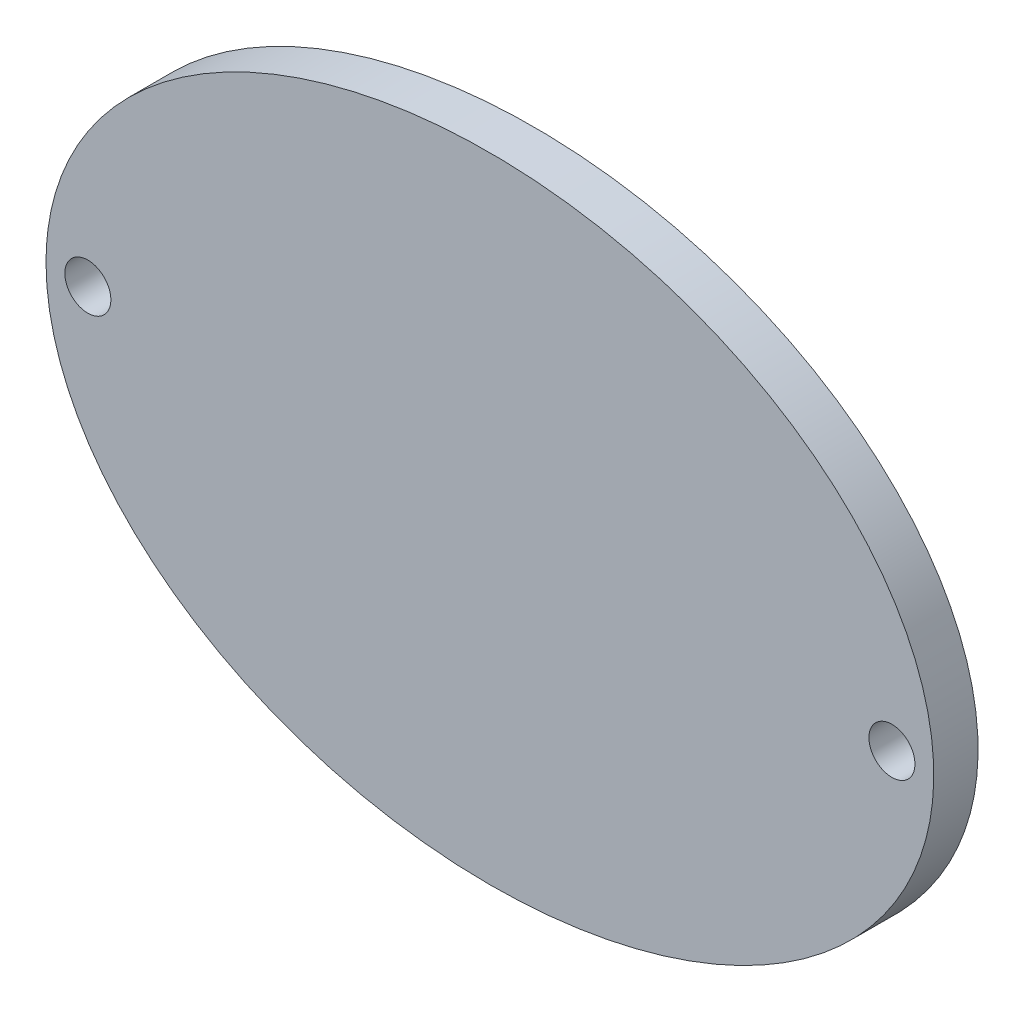
ISO-10303-21;
HEADER;
FILE_DESCRIPTION(('STEP AP214'),'2;1');
FILE_NAME('part.step','',(''),(''),'','','');
FILE_SCHEMA(('AUTOMOTIVE_DESIGN { 1 0 10303 214 1 1 1 1 }'));
ENDSEC;
DATA;
#1=APPLICATION_CONTEXT('core data for automotive mechanical design processes');
#2=APPLICATION_PROTOCOL_DEFINITION('international standard','automotive_design',2000,#1);
#3=PRODUCT_CONTEXT('',#1,'mechanical');
#4=PRODUCT('Part','Part','',(#3));
#5=PRODUCT_RELATED_PRODUCT_CATEGORY('part','',(#4));
#6=PRODUCT_DEFINITION_FORMATION('','',#4);
#7=PRODUCT_DEFINITION_CONTEXT('part definition',#1,'design');
#8=PRODUCT_DEFINITION('design','',#6,#7);
#9=PRODUCT_DEFINITION_SHAPE('','',#8);
#10=(LENGTH_UNIT() NAMED_UNIT(*) SI_UNIT(.MILLI.,.METRE.));
#11=(NAMED_UNIT(*) PLANE_ANGLE_UNIT() SI_UNIT($,.RADIAN.));
#12=(NAMED_UNIT(*) SI_UNIT($,.STERADIAN.) SOLID_ANGLE_UNIT());
#13=UNCERTAINTY_MEASURE_WITH_UNIT(LENGTH_MEASURE(1.E-05),#10,'distance_accuracy_value','');
#14=(GEOMETRIC_REPRESENTATION_CONTEXT(3) GLOBAL_UNCERTAINTY_ASSIGNED_CONTEXT((#13)) GLOBAL_UNIT_ASSIGNED_CONTEXT((#10,
#11,#12)) REPRESENTATION_CONTEXT('',''));
#15=CARTESIAN_POINT('',(0.,0.,0.));
#16=DIRECTION('',(0.,0.,1.));
#17=DIRECTION('',(1.,0.,0.));
#18=AXIS2_PLACEMENT_3D('',#15,#16,#17);
#19=CARTESIAN_POINT('',(0.,0.,3.175));
#20=DIRECTION('',(0.,0.,1.));
#21=DIRECTION('',(-1.,0.,0.));
#22=AXIS2_PLACEMENT_3D('',#19,#20,#21);
#23=ELLIPSE('',#22,31.82,22.725);
#24=DIRECTION('',(0.,0.,-1.));
#25=VECTOR('',#24,1.);
#26=SURFACE_OF_LINEAR_EXTRUSION('',#23,#25);
#27=CARTESIAN_POINT('',(-31.82,0.,3.175));
#28=VERTEX_POINT('',#27);
#29=EDGE_CURVE('E10',#28,#28,#23,.T.);
#30=ORIENTED_EDGE('',*,*,#29,.F.);
#31=EDGE_LOOP('',(#30));
#32=FACE_BOUND('',#31,.T.);
#33=CARTESIAN_POINT('',(0.,0.,0.));
#34=DIRECTION('',(0.,0.,1.));
#35=DIRECTION('',(-1.,0.,0.));
#36=AXIS2_PLACEMENT_3D('',#33,#34,#35);
#37=ELLIPSE('',#36,31.82,22.725);
#38=CARTESIAN_POINT('',(-31.82,0.,0.));
#39=VERTEX_POINT('',#38);
#40=EDGE_CURVE('E41',#39,#39,#37,.T.);
#41=ORIENTED_EDGE('',*,*,#40,.T.);
#42=EDGE_LOOP('',(#41));
#43=FACE_BOUND('',#42,.T.);
#44=ADVANCED_FACE('F37',(#32,#43),#26,.F.);
#45=CARTESIAN_POINT('',(0.,0.,3.175));
#46=DIRECTION('',(0.,0.,1.));
#47=DIRECTION('',(1.,0.,0.));
#48=AXIS2_PLACEMENT_3D('',#45,#46,#47);
#49=PLANE('',#48);
#50=CARTESIAN_POINT('',(-28.8198,0.,3.175));
#51=DIRECTION('',(0.,0.,1.));
#52=DIRECTION('',(1.,0.,0.));
#53=AXIS2_PLACEMENT_3D('',#50,#51,#52);
#54=CIRCLE('',#53,1.65);
#55=CARTESIAN_POINT('',(-27.1698,0.,3.175));
#56=VERTEX_POINT('',#55);
#57=EDGE_CURVE('E60',#56,#56,#54,.T.);
#58=ORIENTED_EDGE('',*,*,#57,.F.);
#59=EDGE_LOOP('',(#58));
#60=FACE_BOUND('',#59,.T.);
#61=CARTESIAN_POINT('',(28.8198,0.,3.175));
#62=DIRECTION('',(0.,0.,1.));
#63=DIRECTION('',(-1.,0.,0.));
#64=AXIS2_PLACEMENT_3D('',#61,#62,#63);
#65=CIRCLE('',#64,1.65);
#66=CARTESIAN_POINT('',(27.1698,0.,3.175));
#67=VERTEX_POINT('',#66);
#68=EDGE_CURVE('E52',#67,#67,#65,.T.);
#69=ORIENTED_EDGE('',*,*,#68,.F.);
#70=EDGE_LOOP('',(#69));
#71=FACE_BOUND('',#70,.T.);
#72=ORIENTED_EDGE('',*,*,#29,.T.);
#73=EDGE_LOOP('',(#72));
#74=FACE_BOUND('',#73,.T.);
#75=ADVANCED_FACE('F78',(#60,#71,#74),#49,.T.);
#76=CARTESIAN_POINT('',(0.,0.,0.));
#77=DIRECTION('',(0.,0.,1.));
#78=DIRECTION('',(1.,0.,0.));
#79=AXIS2_PLACEMENT_3D('',#76,#77,#78);
#80=PLANE('',#79);
#81=CARTESIAN_POINT('',(-28.8198,0.,0.));
#82=DIRECTION('',(0.,0.,1.));
#83=DIRECTION('',(1.,0.,0.));
#84=AXIS2_PLACEMENT_3D('',#81,#82,#83);
#85=CIRCLE('',#84,1.65);
#86=CARTESIAN_POINT('',(-27.1698,0.,0.));
#87=VERTEX_POINT('',#86);
#88=EDGE_CURVE('E49',#87,#87,#85,.T.);
#89=ORIENTED_EDGE('',*,*,#88,.T.);
#90=EDGE_LOOP('',(#89));
#91=FACE_BOUND('',#90,.T.);
#92=CARTESIAN_POINT('',(28.8198,0.,0.));
#93=DIRECTION('',(0.,0.,1.));
#94=DIRECTION('',(-1.,0.,0.));
#95=AXIS2_PLACEMENT_3D('',#92,#93,#94);
#96=CIRCLE('',#95,1.65);
#97=CARTESIAN_POINT('',(27.1698,0.,0.));
#98=VERTEX_POINT('',#97);
#99=EDGE_CURVE('E56',#98,#98,#96,.T.);
#100=ORIENTED_EDGE('',*,*,#99,.T.);
#101=EDGE_LOOP('',(#100));
#102=FACE_BOUND('',#101,.T.);
#103=ORIENTED_EDGE('',*,*,#40,.F.);
#104=EDGE_LOOP('',(#103));
#105=FACE_BOUND('',#104,.T.);
#106=ADVANCED_FACE('F68',(#91,#102,#105),#80,.F.);
#107=CARTESIAN_POINT('',(28.8198,0.,0.));
#108=DIRECTION('',(0.,0.,1.));
#109=DIRECTION('',(1.,0.,0.));
#110=AXIS2_PLACEMENT_3D('',#107,#108,#109);
#111=CYLINDRICAL_SURFACE('',#110,1.65);
#112=ORIENTED_EDGE('',*,*,#99,.F.);
#113=EDGE_LOOP('',(#112));
#114=FACE_BOUND('',#113,.T.);
#115=ORIENTED_EDGE('',*,*,#68,.T.);
#116=EDGE_LOOP('',(#115));
#117=FACE_BOUND('',#116,.T.);
#118=ADVANCED_FACE('F74',(#114,#117),#111,.F.);
#119=CARTESIAN_POINT('',(-28.8198,0.,0.));
#120=DIRECTION('',(0.,0.,1.));
#121=DIRECTION('',(1.,0.,0.));
#122=AXIS2_PLACEMENT_3D('',#119,#120,#121);
#123=CYLINDRICAL_SURFACE('',#122,1.65);
#124=ORIENTED_EDGE('',*,*,#88,.F.);
#125=EDGE_LOOP('',(#124));
#126=FACE_BOUND('',#125,.T.);
#127=ORIENTED_EDGE('',*,*,#57,.T.);
#128=EDGE_LOOP('',(#127));
#129=FACE_BOUND('',#128,.T.);
#130=ADVANCED_FACE('F71',(#126,#129),#123,.F.);
#131=CLOSED_SHELL('',(#44,#75,#106,#118,#130));
#132=MANIFOLD_SOLID_BREP('B2',#131);
#133=ADVANCED_BREP_SHAPE_REPRESENTATION('',(#18,#132),#14);
#134=SHAPE_DEFINITION_REPRESENTATION(#9,#133);
ENDSEC;
END-ISO-10303-21;
